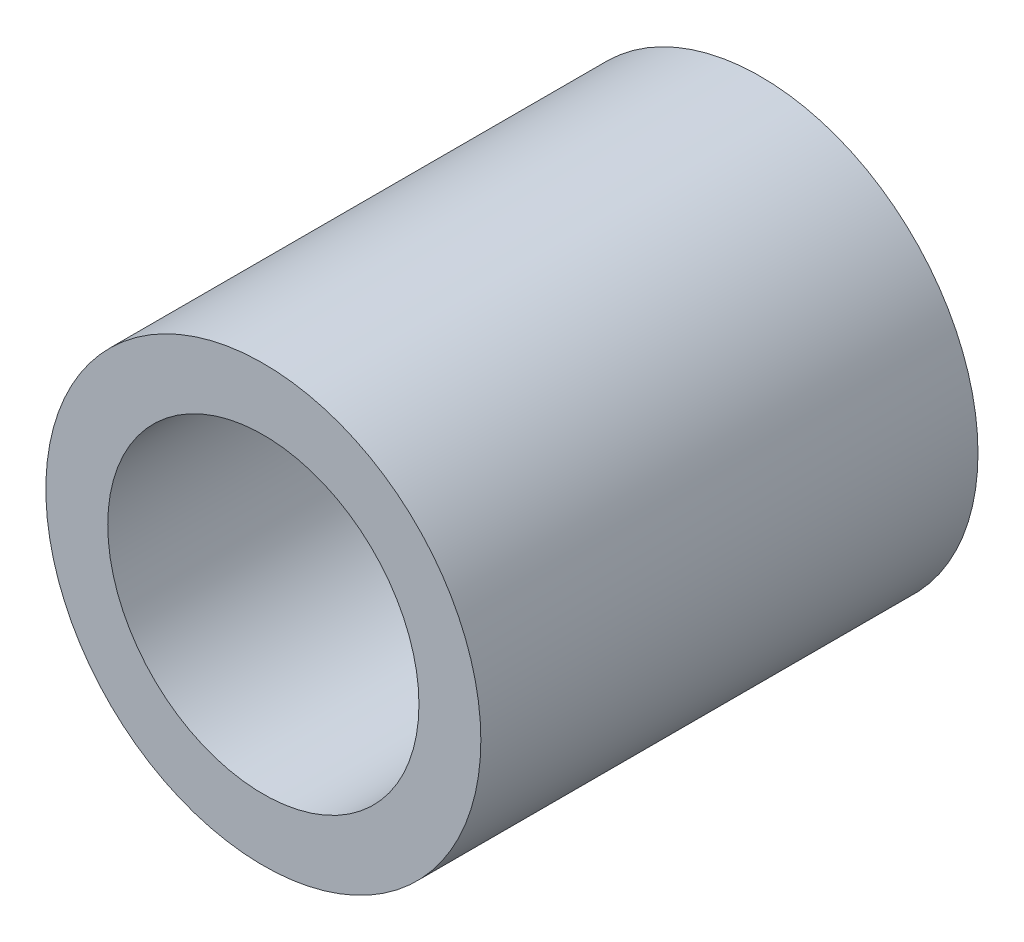
ISO-10303-21;
HEADER;
FILE_DESCRIPTION(('STEP AP214'),'2;1');
FILE_NAME('part.step','',(''),(''),'','','');
FILE_SCHEMA(('AUTOMOTIVE_DESIGN { 1 0 10303 214 1 1 1 1 }'));
ENDSEC;
DATA;
#1=APPLICATION_CONTEXT('core data for automotive mechanical design processes');
#2=APPLICATION_PROTOCOL_DEFINITION('international standard','automotive_design',2000,#1);
#3=PRODUCT_CONTEXT('',#1,'mechanical');
#4=PRODUCT('Part','Part','',(#3));
#5=PRODUCT_RELATED_PRODUCT_CATEGORY('part','',(#4));
#6=PRODUCT_DEFINITION_FORMATION('','',#4);
#7=PRODUCT_DEFINITION_CONTEXT('part definition',#1,'design');
#8=PRODUCT_DEFINITION('design','',#6,#7);
#9=PRODUCT_DEFINITION_SHAPE('','',#8);
#10=(LENGTH_UNIT() NAMED_UNIT(*) SI_UNIT(.MILLI.,.METRE.));
#11=(NAMED_UNIT(*) PLANE_ANGLE_UNIT() SI_UNIT($,.RADIAN.));
#12=(NAMED_UNIT(*) SI_UNIT($,.STERADIAN.) SOLID_ANGLE_UNIT());
#13=UNCERTAINTY_MEASURE_WITH_UNIT(LENGTH_MEASURE(1.E-05),#10,'distance_accuracy_value','');
#14=(GEOMETRIC_REPRESENTATION_CONTEXT(3) GLOBAL_UNCERTAINTY_ASSIGNED_CONTEXT((#13)) GLOBAL_UNIT_ASSIGNED_CONTEXT((#10,
#11,#12)) REPRESENTATION_CONTEXT('',''));
#15=CARTESIAN_POINT('',(0.,0.,0.));
#16=DIRECTION('',(0.,0.,1.));
#17=DIRECTION('',(1.,0.,0.));
#18=AXIS2_PLACEMENT_3D('',#15,#16,#17);
#19=CARTESIAN_POINT('',(0.,0.,6.35));
#20=DIRECTION('',(0.,0.,1.));
#21=DIRECTION('',(1.,0.,0.));
#22=AXIS2_PLACEMENT_3D('',#19,#20,#21);
#23=PLANE('',#22);
#24=CARTESIAN_POINT('',(0.,0.,6.35));
#25=DIRECTION('',(0.,0.,1.));
#26=DIRECTION('',(1.,0.,0.));
#27=AXIS2_PLACEMENT_3D('',#24,#25,#26);
#28=CIRCLE('',#27,5.55625);
#29=CARTESIAN_POINT('',(5.55625,0.,6.35));
#30=VERTEX_POINT('',#29);
#31=EDGE_CURVE('E10',#30,#30,#28,.T.);
#32=ORIENTED_EDGE('',*,*,#31,.T.);
#33=EDGE_LOOP('',(#32));
#34=FACE_BOUND('',#33,.T.);
#35=CARTESIAN_POINT('',(0.,0.,6.35));
#36=DIRECTION('',(0.,0.,1.));
#37=DIRECTION('',(1.,0.,0.));
#38=AXIS2_PLACEMENT_3D('',#35,#36,#37);
#39=CIRCLE('',#38,3.9751);
#40=CARTESIAN_POINT('',(3.9751,0.,6.35));
#41=VERTEX_POINT('',#40);
#42=EDGE_CURVE('E41',#41,#41,#39,.T.);
#43=ORIENTED_EDGE('',*,*,#42,.F.);
#44=EDGE_LOOP('',(#43));
#45=FACE_BOUND('',#44,.T.);
#46=ADVANCED_FACE('F30',(#34,#45),#23,.T.);
#47=CARTESIAN_POINT('',(0.,0.,-6.35));
#48=DIRECTION('',(0.,0.,1.));
#49=DIRECTION('',(1.,0.,0.));
#50=AXIS2_PLACEMENT_3D('',#47,#48,#49);
#51=PLANE('',#50);
#52=CARTESIAN_POINT('',(0.,0.,-6.35));
#53=DIRECTION('',(0.,0.,1.));
#54=DIRECTION('',(1.,0.,0.));
#55=AXIS2_PLACEMENT_3D('',#52,#53,#54);
#56=CIRCLE('',#55,5.55625);
#57=CARTESIAN_POINT('',(5.55625,0.,-6.35));
#58=VERTEX_POINT('',#57);
#59=EDGE_CURVE('E34',#58,#58,#56,.T.);
#60=ORIENTED_EDGE('',*,*,#59,.F.);
#61=EDGE_LOOP('',(#60));
#62=FACE_BOUND('',#61,.T.);
#63=CARTESIAN_POINT('',(0.,0.,-6.35));
#64=DIRECTION('',(0.,0.,1.));
#65=DIRECTION('',(1.,0.,0.));
#66=AXIS2_PLACEMENT_3D('',#63,#64,#65);
#67=CIRCLE('',#66,3.9751);
#68=CARTESIAN_POINT('',(3.9751,0.,-6.35));
#69=VERTEX_POINT('',#68);
#70=EDGE_CURVE('E43',#69,#69,#67,.T.);
#71=ORIENTED_EDGE('',*,*,#70,.T.);
#72=EDGE_LOOP('',(#71));
#73=FACE_BOUND('',#72,.T.);
#74=ADVANCED_FACE('F53',(#62,#73),#51,.F.);
#75=CARTESIAN_POINT('',(0.,0.,6.35));
#76=DIRECTION('',(0.,0.,-1.));
#77=DIRECTION('',(-1.,0.,0.));
#78=AXIS2_PLACEMENT_3D('',#75,#76,#77);
#79=CYLINDRICAL_SURFACE('',#78,5.55625);
#80=ORIENTED_EDGE('',*,*,#31,.F.);
#81=EDGE_LOOP('',(#80));
#82=FACE_BOUND('',#81,.T.);
#83=ORIENTED_EDGE('',*,*,#59,.T.);
#84=EDGE_LOOP('',(#83));
#85=FACE_BOUND('',#84,.T.);
#86=ADVANCED_FACE('F32',(#82,#85),#79,.T.);
#87=CARTESIAN_POINT('',(0.,0.,6.35));
#88=DIRECTION('',(0.,0.,-1.));
#89=DIRECTION('',(-1.,0.,0.));
#90=AXIS2_PLACEMENT_3D('',#87,#88,#89);
#91=CYLINDRICAL_SURFACE('',#90,3.9751);
#92=ORIENTED_EDGE('',*,*,#42,.T.);
#93=EDGE_LOOP('',(#92));
#94=FACE_BOUND('',#93,.T.);
#95=ORIENTED_EDGE('',*,*,#70,.F.);
#96=EDGE_LOOP('',(#95));
#97=FACE_BOUND('',#96,.T.);
#98=ADVANCED_FACE('F49',(#94,#97),#91,.F.);
#99=CLOSED_SHELL('',(#46,#74,#86,#98));
#100=MANIFOLD_SOLID_BREP('B2',#99);
#101=ADVANCED_BREP_SHAPE_REPRESENTATION('',(#18,#100),#14);
#102=SHAPE_DEFINITION_REPRESENTATION(#9,#101);
ENDSEC;
END-ISO-10303-21;
